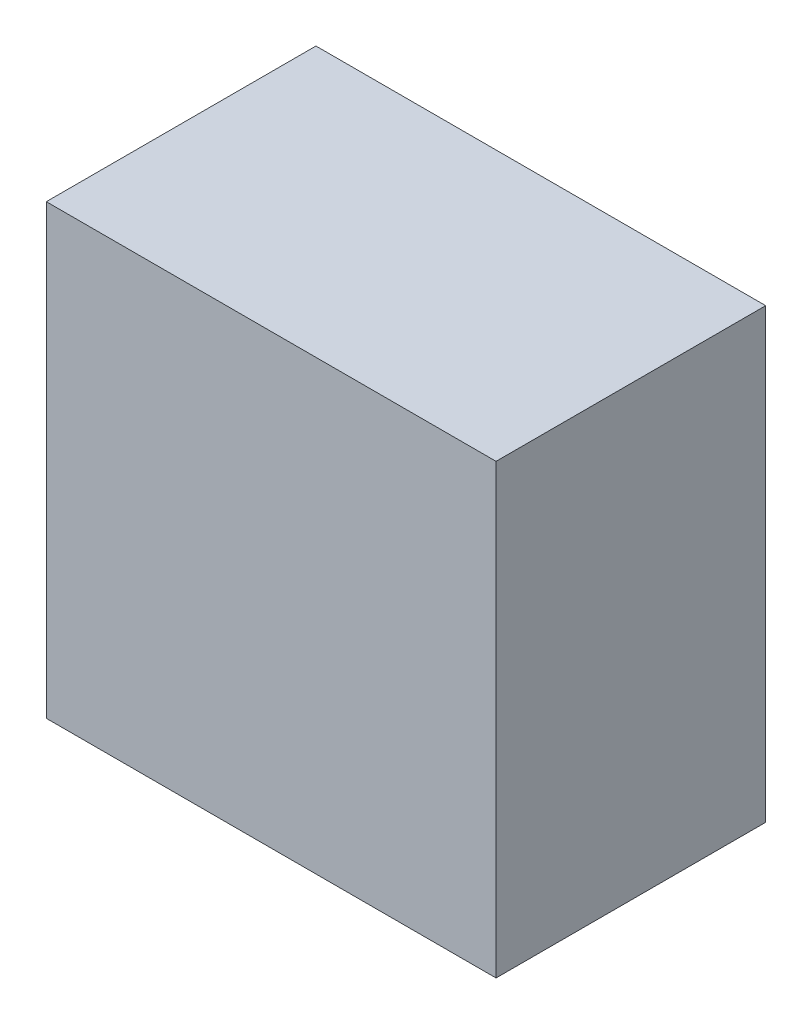
ISO-10303-21;
HEADER;
FILE_DESCRIPTION(('STEP AP214'),'2;1');
FILE_NAME('part.step','',(''),(''),'','','');
FILE_SCHEMA(('AUTOMOTIVE_DESIGN { 1 0 10303 214 1 1 1 1 }'));
ENDSEC;
DATA;
#1=APPLICATION_CONTEXT('core data for automotive mechanical design processes');
#2=APPLICATION_PROTOCOL_DEFINITION('international standard','automotive_design',2000,#1);
#3=PRODUCT_CONTEXT('',#1,'mechanical');
#4=PRODUCT('Part','Part','',(#3));
#5=PRODUCT_RELATED_PRODUCT_CATEGORY('part','',(#4));
#6=PRODUCT_DEFINITION_FORMATION('','',#4);
#7=PRODUCT_DEFINITION_CONTEXT('part definition',#1,'design');
#8=PRODUCT_DEFINITION('design','',#6,#7);
#9=PRODUCT_DEFINITION_SHAPE('','',#8);
#10=(LENGTH_UNIT() NAMED_UNIT(*) SI_UNIT(.MILLI.,.METRE.));
#11=(NAMED_UNIT(*) PLANE_ANGLE_UNIT() SI_UNIT($,.RADIAN.));
#12=(NAMED_UNIT(*) SI_UNIT($,.STERADIAN.) SOLID_ANGLE_UNIT());
#13=UNCERTAINTY_MEASURE_WITH_UNIT(LENGTH_MEASURE(1.E-05),#10,'distance_accuracy_value','');
#14=(GEOMETRIC_REPRESENTATION_CONTEXT(3) GLOBAL_UNCERTAINTY_ASSIGNED_CONTEXT((#13)) GLOBAL_UNIT_ASSIGNED_CONTEXT((#10,
#11,#12)) REPRESENTATION_CONTEXT('',''));
#15=CARTESIAN_POINT('',(0.,0.,0.));
#16=DIRECTION('',(0.,0.,1.));
#17=DIRECTION('',(1.,0.,0.));
#18=AXIS2_PLACEMENT_3D('',#15,#16,#17);
#19=CARTESIAN_POINT('',(2.5019,2.4892,2.99999908));
#20=DIRECTION('',(0.,0.,1.));
#21=DIRECTION('',(1.,0.,0.));
#22=AXIS2_PLACEMENT_3D('',#19,#20,#21);
#23=PLANE('',#22);
#24=DIRECTION('',(1.,0.,0.));
#25=VECTOR('',#24,1.);
#26=CARTESIAN_POINT('',(2.5019,-2.4892,2.99999908));
#27=LINE('',#26,#25);
#28=CARTESIAN_POINT('',(2.5019,-2.4892,2.99999908));
#29=VERTEX_POINT('',#28);
#30=CARTESIAN_POINT('',(-2.5019,-2.4892,2.99999908));
#31=VERTEX_POINT('',#30);
#32=EDGE_CURVE('E53',#29,#31,#27,.F.);
#33=ORIENTED_EDGE('',*,*,#32,.F.);
#34=DIRECTION('',(0.,1.,0.));
#35=VECTOR('',#34,1.);
#36=CARTESIAN_POINT('',(2.5019,2.4892,2.99999908));
#37=LINE('',#36,#35);
#38=CARTESIAN_POINT('',(2.5019,2.4892,2.99999908));
#39=VERTEX_POINT('',#38);
#40=EDGE_CURVE('E68',#39,#29,#37,.F.);
#41=ORIENTED_EDGE('',*,*,#40,.F.);
#42=DIRECTION('',(1.,0.,0.));
#43=VECTOR('',#42,1.);
#44=CARTESIAN_POINT('',(-2.5019,2.4892,2.99999908));
#45=LINE('',#44,#43);
#46=CARTESIAN_POINT('',(-2.5019,2.4892,2.99999908));
#47=VERTEX_POINT('',#46);
#48=EDGE_CURVE('E20',#47,#39,#45,.T.);
#49=ORIENTED_EDGE('',*,*,#48,.F.);
#50=DIRECTION('',(0.,1.,0.));
#51=VECTOR('',#50,1.);
#52=CARTESIAN_POINT('',(-2.5019,-2.4892,2.99999908));
#53=LINE('',#52,#51);
#54=EDGE_CURVE('E58',#31,#47,#53,.T.);
#55=ORIENTED_EDGE('',*,*,#54,.F.);
#56=EDGE_LOOP('',(#33,#41,#49,#55));
#57=FACE_BOUND('',#56,.T.);
#58=ADVANCED_FACE('F17',(#57),#23,.T.);
#59=CARTESIAN_POINT('',(-2.5019,2.4892,0.));
#60=DIRECTION('',(0.,1.,0.));
#61=DIRECTION('',(0.,0.,1.));
#62=AXIS2_PLACEMENT_3D('',#59,#60,#61);
#63=PLANE('',#62);
#64=DIRECTION('',(0.,0.,-1.));
#65=VECTOR('',#64,1.);
#66=CARTESIAN_POINT('',(2.5019,2.4892,0.));
#67=LINE('',#66,#65);
#68=CARTESIAN_POINT('',(2.5019,2.4892,0.));
#69=VERTEX_POINT('',#68);
#70=EDGE_CURVE('E79',#69,#39,#67,.F.);
#71=ORIENTED_EDGE('',*,*,#70,.F.);
#72=DIRECTION('',(1.,0.,0.));
#73=VECTOR('',#72,1.);
#74=CARTESIAN_POINT('',(2.5019,2.4892,0.));
#75=LINE('',#74,#73);
#76=CARTESIAN_POINT('',(-2.5019,2.4892,0.));
#77=VERTEX_POINT('',#76);
#78=EDGE_CURVE('E74',#69,#77,#75,.F.);
#79=ORIENTED_EDGE('',*,*,#78,.T.);
#80=DIRECTION('',(0.,0.,1.));
#81=VECTOR('',#80,1.);
#82=CARTESIAN_POINT('',(-2.5019,2.4892,0.));
#83=LINE('',#82,#81);
#84=EDGE_CURVE('E63',#47,#77,#83,.F.);
#85=ORIENTED_EDGE('',*,*,#84,.F.);
#86=ORIENTED_EDGE('',*,*,#48,.T.);
#87=EDGE_LOOP('',(#71,#79,#85,#86));
#88=FACE_BOUND('',#87,.T.);
#89=ADVANCED_FACE('F73',(#88),#63,.T.);
#90=CARTESIAN_POINT('',(-2.5019,-2.4892,0.));
#91=DIRECTION('',(-1.,0.,0.));
#92=DIRECTION('',(0.,0.,1.));
#93=AXIS2_PLACEMENT_3D('',#90,#91,#92);
#94=PLANE('',#93);
#95=ORIENTED_EDGE('',*,*,#84,.T.);
#96=DIRECTION('',(0.,1.,0.));
#97=VECTOR('',#96,1.);
#98=CARTESIAN_POINT('',(-2.5019,2.4892,0.));
#99=LINE('',#98,#97);
#100=CARTESIAN_POINT('',(-2.5019,-2.4892,0.));
#101=VERTEX_POINT('',#100);
#102=EDGE_CURVE('E84',#77,#101,#99,.F.);
#103=ORIENTED_EDGE('',*,*,#102,.T.);
#104=DIRECTION('',(0.,0.,-1.));
#105=VECTOR('',#104,1.);
#106=CARTESIAN_POINT('',(-2.5019,-2.4892,0.));
#107=LINE('',#106,#105);
#108=EDGE_CURVE('E65',#31,#101,#107,.T.);
#109=ORIENTED_EDGE('',*,*,#108,.F.);
#110=ORIENTED_EDGE('',*,*,#54,.T.);
#111=EDGE_LOOP('',(#95,#103,#109,#110));
#112=FACE_BOUND('',#111,.T.);
#113=ADVANCED_FACE('F60',(#112),#94,.T.);
#114=CARTESIAN_POINT('',(2.5019,-2.4892,0.));
#115=DIRECTION('',(0.,-1.,0.));
#116=DIRECTION('',(0.,0.,-1.));
#117=AXIS2_PLACEMENT_3D('',#114,#115,#116);
#118=PLANE('',#117);
#119=ORIENTED_EDGE('',*,*,#108,.T.);
#120=DIRECTION('',(1.,0.,0.));
#121=VECTOR('',#120,1.);
#122=CARTESIAN_POINT('',(2.5019,-2.4892,0.));
#123=LINE('',#122,#121);
#124=CARTESIAN_POINT('',(2.5019,-2.4892,0.));
#125=VERTEX_POINT('',#124);
#126=EDGE_CURVE('E26',#101,#125,#123,.T.);
#127=ORIENTED_EDGE('',*,*,#126,.T.);
#128=DIRECTION('',(0.,0.,-1.));
#129=VECTOR('',#128,1.);
#130=CARTESIAN_POINT('',(2.5019,-2.4892,0.));
#131=LINE('',#130,#129);
#132=EDGE_CURVE('E34',#29,#125,#131,.T.);
#133=ORIENTED_EDGE('',*,*,#132,.F.);
#134=ORIENTED_EDGE('',*,*,#32,.T.);
#135=EDGE_LOOP('',(#119,#127,#133,#134));
#136=FACE_BOUND('',#135,.T.);
#137=ADVANCED_FACE('F88',(#136),#118,.T.);
#138=CARTESIAN_POINT('',(2.5019,2.4892,0.));
#139=DIRECTION('',(1.,0.,0.));
#140=DIRECTION('',(0.,0.,-1.));
#141=AXIS2_PLACEMENT_3D('',#138,#139,#140);
#142=PLANE('',#141);
#143=ORIENTED_EDGE('',*,*,#132,.T.);
#144=DIRECTION('',(0.,1.,0.));
#145=VECTOR('',#144,1.);
#146=CARTESIAN_POINT('',(2.5019,2.4892,0.));
#147=LINE('',#146,#145);
#148=EDGE_CURVE('E11',#125,#69,#147,.T.);
#149=ORIENTED_EDGE('',*,*,#148,.T.);
#150=ORIENTED_EDGE('',*,*,#70,.T.);
#151=ORIENTED_EDGE('',*,*,#40,.T.);
#152=EDGE_LOOP('',(#143,#149,#150,#151));
#153=FACE_BOUND('',#152,.T.);
#154=ADVANCED_FACE('F91',(#153),#142,.T.);
#155=CARTESIAN_POINT('',(2.5019,2.4892,0.));
#156=DIRECTION('',(0.,0.,1.));
#157=DIRECTION('',(1.,0.,0.));
#158=AXIS2_PLACEMENT_3D('',#155,#156,#157);
#159=PLANE('',#158);
#160=ORIENTED_EDGE('',*,*,#126,.F.);
#161=ORIENTED_EDGE('',*,*,#102,.F.);
#162=ORIENTED_EDGE('',*,*,#78,.F.);
#163=ORIENTED_EDGE('',*,*,#148,.F.);
#164=EDGE_LOOP('',(#160,#161,#162,#163));
#165=FACE_BOUND('',#164,.T.);
#166=ADVANCED_FACE('F90',(#165),#159,.F.);
#167=CLOSED_SHELL('',(#58,#89,#113,#137,#154,#166));
#168=MANIFOLD_SOLID_BREP('B1',#167);
#169=ADVANCED_BREP_SHAPE_REPRESENTATION('',(#18,#168),#14);
#170=SHAPE_DEFINITION_REPRESENTATION(#9,#169);
ENDSEC;
END-ISO-10303-21;
